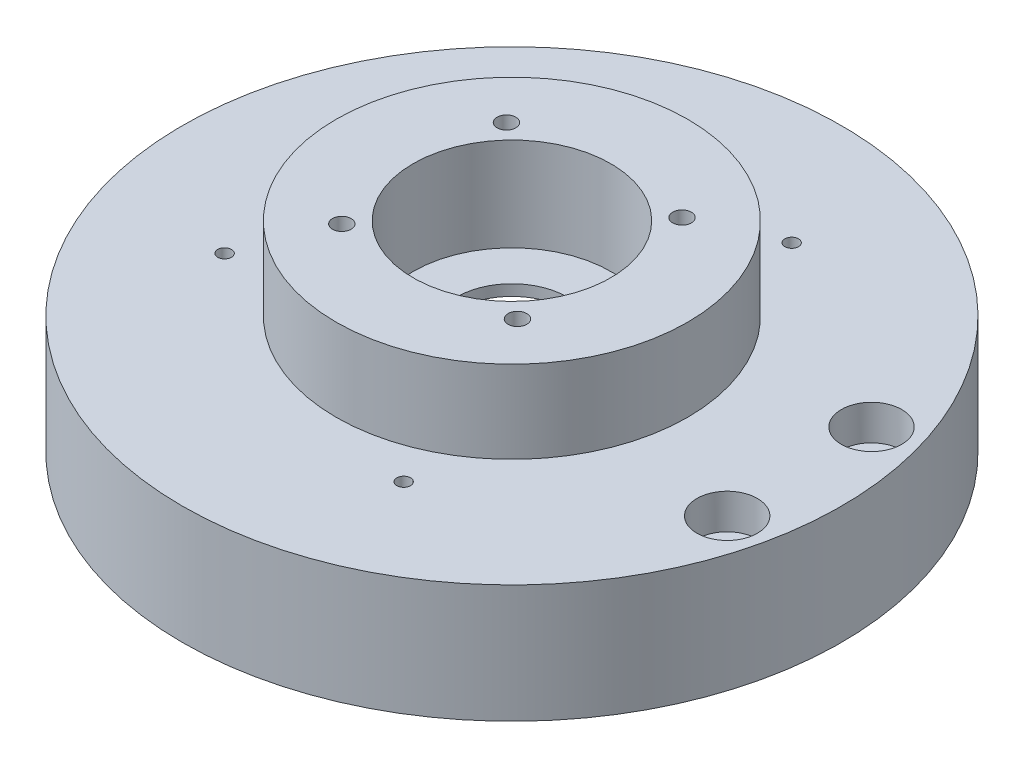
ISO-10303-21;
HEADER;
FILE_DESCRIPTION(('STEP AP214'),'2;1');
FILE_NAME('part.step','',(''),(''),'','','');
FILE_SCHEMA(('AUTOMOTIVE_DESIGN { 1 0 10303 214 1 1 1 1 }'));
ENDSEC;
DATA;
#1=APPLICATION_CONTEXT('core data for automotive mechanical design processes');
#2=APPLICATION_PROTOCOL_DEFINITION('international standard','automotive_design',2000,#1);
#3=PRODUCT_CONTEXT('',#1,'mechanical');
#4=PRODUCT('Part','Part','',(#3));
#5=PRODUCT_RELATED_PRODUCT_CATEGORY('part','',(#4));
#6=PRODUCT_DEFINITION_FORMATION('','',#4);
#7=PRODUCT_DEFINITION_CONTEXT('part definition',#1,'design');
#8=PRODUCT_DEFINITION('design','',#6,#7);
#9=PRODUCT_DEFINITION_SHAPE('','',#8);
#10=(LENGTH_UNIT() NAMED_UNIT(*) SI_UNIT(.MILLI.,.METRE.));
#11=(NAMED_UNIT(*) PLANE_ANGLE_UNIT() SI_UNIT($,.RADIAN.));
#12=(NAMED_UNIT(*) SI_UNIT($,.STERADIAN.) SOLID_ANGLE_UNIT());
#13=UNCERTAINTY_MEASURE_WITH_UNIT(LENGTH_MEASURE(1.E-05),#10,'distance_accuracy_value','');
#14=(GEOMETRIC_REPRESENTATION_CONTEXT(3) GLOBAL_UNCERTAINTY_ASSIGNED_CONTEXT((#13)) GLOBAL_UNIT_ASSIGNED_CONTEXT((#10,
#11,#12)) REPRESENTATION_CONTEXT('',''));
#15=CARTESIAN_POINT('',(0.,0.,0.));
#16=DIRECTION('',(0.,0.,1.));
#17=DIRECTION('',(1.,0.,0.));
#18=AXIS2_PLACEMENT_3D('',#15,#16,#17);
#19=CARTESIAN_POINT('',(0.,36.5,0.));
#20=DIRECTION('',(0.,1.,0.));
#21=DIRECTION('',(0.,0.,1.));
#22=AXIS2_PLACEMENT_3D('',#19,#20,#21);
#23=PLANE('',#22);
#24=CARTESIAN_POINT('',(0.,36.5,0.));
#25=DIRECTION('',(0.,1.,0.));
#26=DIRECTION('',(-1.,0.,0.));
#27=AXIS2_PLACEMENT_3D('',#24,#25,#26);
#28=CIRCLE('',#27,18.);
#29=CARTESIAN_POINT('',(-18.,36.5,0.));
#30=VERTEX_POINT('',#29);
#31=EDGE_CURVE('E239',#30,#30,#28,.T.);
#32=ORIENTED_EDGE('',*,*,#31,.F.);
#33=EDGE_LOOP('',(#32));
#34=FACE_BOUND('',#33,.T.);
#35=CARTESIAN_POINT('',(-15.9871691546974,36.5,-14.9846085841137));
#36=DIRECTION('',(0.,1.,0.));
#37=DIRECTION('',(0.,0.,1.));
#38=AXIS2_PLACEMENT_3D('',#35,#36,#37);
#39=CIRCLE('',#38,1.69999999999999);
#40=CARTESIAN_POINT('',(-15.9871691546974,36.5,-13.2846085841137));
#41=VERTEX_POINT('',#40);
#42=EDGE_CURVE('E200',#41,#41,#39,.T.);
#43=ORIENTED_EDGE('',*,*,#42,.F.);
#44=EDGE_LOOP('',(#43));
#45=FACE_BOUND('',#44,.T.);
#46=CARTESIAN_POINT('',(-14.9846085841137,36.5,15.9871691546974));
#47=DIRECTION('',(0.,1.,0.));
#48=DIRECTION('',(0.,0.,1.));
#49=AXIS2_PLACEMENT_3D('',#46,#47,#48);
#50=CIRCLE('',#49,1.69999999999999);
#51=CARTESIAN_POINT('',(-14.9846085841137,36.5,17.6871691546974));
#52=VERTEX_POINT('',#51);
#53=EDGE_CURVE('E197',#52,#52,#50,.T.);
#54=ORIENTED_EDGE('',*,*,#53,.F.);
#55=EDGE_LOOP('',(#54));
#56=FACE_BOUND('',#55,.T.);
#57=CARTESIAN_POINT('',(15.9871691546974,36.5,14.9846085841137));
#58=DIRECTION('',(0.,1.,0.));
#59=DIRECTION('',(0.,0.,1.));
#60=AXIS2_PLACEMENT_3D('',#57,#58,#59);
#61=CIRCLE('',#60,1.7);
#62=CARTESIAN_POINT('',(15.9871691546974,36.5,16.6846085841137));
#63=VERTEX_POINT('',#62);
#64=EDGE_CURVE('E194',#63,#63,#61,.T.);
#65=ORIENTED_EDGE('',*,*,#64,.F.);
#66=EDGE_LOOP('',(#65));
#67=FACE_BOUND('',#66,.T.);
#68=CARTESIAN_POINT('',(14.9846085841137,36.5,-15.9871691546974));
#69=DIRECTION('',(0.,1.,0.));
#70=DIRECTION('',(0.,0.,1.));
#71=AXIS2_PLACEMENT_3D('',#68,#69,#70);
#72=CIRCLE('',#71,1.7);
#73=CARTESIAN_POINT('',(14.9846085841137,36.5,-14.2871691546974));
#74=VERTEX_POINT('',#73);
#75=EDGE_CURVE('E191',#74,#74,#72,.T.);
#76=ORIENTED_EDGE('',*,*,#75,.F.);
#77=EDGE_LOOP('',(#76));
#78=FACE_BOUND('',#77,.T.);
#79=CARTESIAN_POINT('',(0.,36.5,0.));
#80=DIRECTION('',(0.,1.,0.));
#81=DIRECTION('',(0.,0.,1.));
#82=AXIS2_PLACEMENT_3D('',#79,#80,#81);
#83=CIRCLE('',#82,32.);
#84=CARTESIAN_POINT('',(0.,36.5,32.));
#85=VERTEX_POINT('',#84);
#86=EDGE_CURVE('E143',#85,#85,#83,.T.);
#87=ORIENTED_EDGE('',*,*,#86,.T.);
#88=EDGE_LOOP('',(#87));
#89=FACE_BOUND('',#88,.T.);
#90=ADVANCED_FACE('F34',(#34,#45,#56,#67,#78,#89),#23,.T.);
#91=CARTESIAN_POINT('',(0.,5.,0.));
#92=DIRECTION('',(0.,-1.,0.));
#93=DIRECTION('',(0.,0.,-1.));
#94=AXIS2_PLACEMENT_3D('',#91,#92,#93);
#95=PLANE('',#94);
#96=CARTESIAN_POINT('',(51.1241736514381,5.,11.9402206201396));
#97=DIRECTION('',(0.,-1.,0.));
#98=DIRECTION('',(0.,0.,-1.));
#99=AXIS2_PLACEMENT_3D('',#96,#97,#98);
#100=CIRCLE('',#99,3.19999999999999);
#101=CARTESIAN_POINT('',(53.0567468658178,5.,14.4907422865957));
#102=VERTEX_POINT('',#101);
#103=CARTESIAN_POINT('',(48.2094211776642,5.,13.2609090832636));
#104=VERTEX_POINT('',#103);
#105=EDGE_CURVE('E215',#102,#104,#100,.T.);
#106=ORIENTED_EDGE('',*,*,#105,.F.);
#107=CARTESIAN_POINT('',(0.,5.,0.));
#108=DIRECTION('',(0.,-1.,0.));
#109=DIRECTION('',(0.,0.,-1.));
#110=AXIS2_PLACEMENT_3D('',#107,#108,#109);
#111=CIRCLE('',#110,55.);
#112=CARTESIAN_POINT('',(52.0085222795211,5.,-17.8917190426341));
#113=VERTEX_POINT('',#112);
#114=EDGE_CURVE('E271',#102,#113,#111,.T.);
#115=ORIENTED_EDGE('',*,*,#114,.T.);
#116=CARTESIAN_POINT('',(50.2449434397022,5.,-15.2215524418874));
#117=DIRECTION('',(0.,-1.,0.));
#118=DIRECTION('',(0.,0.,-1.));
#119=AXIS2_PLACEMENT_3D('',#116,#117,#118);
#120=CIRCLE('',#119,3.19999999999999);
#121=CARTESIAN_POINT('',(47.250880650459,5.,-16.3509717679434));
#122=VERTEX_POINT('',#121);
#123=EDGE_CURVE('E228',#122,#113,#120,.T.);
#124=ORIENTED_EDGE('',*,*,#123,.F.);
#125=CARTESIAN_POINT('',(0.,5.,0.));
#126=DIRECTION('',(0.,-1.,0.));
#127=DIRECTION('',(0.,0.,-1.));
#128=AXIS2_PLACEMENT_3D('',#125,#126,#127);
#129=CIRCLE('',#128,50.);
#130=EDGE_CURVE('E272',#104,#122,#129,.T.);
#131=ORIENTED_EDGE('',*,*,#130,.F.);
#132=EDGE_LOOP('',(#106,#115,#124,#131));
#133=FACE_BOUND('',#132,.T.);
#134=ADVANCED_FACE('F318',(#133),#95,.T.);
#135=CARTESIAN_POINT('',(0.,5.,0.));
#136=DIRECTION('',(0.,-1.,0.));
#137=DIRECTION('',(0.,0.,-1.));
#138=AXIS2_PLACEMENT_3D('',#135,#136,#137);
#139=CYLINDRICAL_SURFACE('',#138,50.);
#140=DIRECTION('',(0.,1.,0.));
#141=VECTOR('',#140,1.);
#142=CARTESIAN_POINT('',(48.2094211776642,7.55,13.2609090832636));
#143=LINE('',#142,#141);
#144=CARTESIAN_POINT('',(48.2094211776642,0.,13.2609090832636));
#145=VERTEX_POINT('',#144);
#146=EDGE_CURVE('E217',#104,#145,#143,.F.);
#147=ORIENTED_EDGE('',*,*,#146,.F.);
#148=ORIENTED_EDGE('',*,*,#130,.T.);
#149=DIRECTION('',(0.,1.,0.));
#150=VECTOR('',#149,1.);
#151=CARTESIAN_POINT('',(47.2508806504589,7.55,-16.3509717679434));
#152=LINE('',#151,#150);
#153=CARTESIAN_POINT('',(47.2508806504589,0.,-16.3509717679434));
#154=VERTEX_POINT('',#153);
#155=EDGE_CURVE('E288',#154,#122,#152,.T.);
#156=ORIENTED_EDGE('',*,*,#155,.F.);
#157=CARTESIAN_POINT('',(0.,0.,0.));
#158=DIRECTION('',(0.,-1.,0.));
#159=DIRECTION('',(0.,0.,-1.));
#160=AXIS2_PLACEMENT_3D('',#157,#158,#159);
#161=CIRCLE('',#160,50.);
#162=EDGE_CURVE('E267',#145,#154,#161,.T.);
#163=ORIENTED_EDGE('',*,*,#162,.F.);
#164=EDGE_LOOP('',(#147,#148,#156,#163));
#165=FACE_BOUND('',#164,.T.);
#166=ADVANCED_FACE('F314',(#165),#139,.T.);
#167=CARTESIAN_POINT('',(0.,5.,0.));
#168=DIRECTION('',(0.,-1.,0.));
#169=DIRECTION('',(0.,0.,-1.));
#170=AXIS2_PLACEMENT_3D('',#167,#168,#169);
#171=CYLINDRICAL_SURFACE('',#170,55.);
#172=ORIENTED_EDGE('',*,*,#114,.F.);
#173=DIRECTION('',(0.,1.,0.));
#174=VECTOR('',#173,1.);
#175=CARTESIAN_POINT('',(53.0567468658178,7.55,14.4907422865957));
#176=LINE('',#175,#174);
#177=CARTESIAN_POINT('',(53.0567468658178,0.,14.4907422865957));
#178=VERTEX_POINT('',#177);
#179=EDGE_CURVE('E11',#102,#178,#176,.F.);
#180=ORIENTED_EDGE('',*,*,#179,.T.);
#181=CARTESIAN_POINT('',(0.,0.,0.));
#182=DIRECTION('',(0.,-1.,0.));
#183=DIRECTION('',(0.,0.,-1.));
#184=AXIS2_PLACEMENT_3D('',#181,#182,#183);
#185=CIRCLE('',#184,55.);
#186=CARTESIAN_POINT('',(52.0085222795211,0.,-17.8917190426341));
#187=VERTEX_POINT('',#186);
#188=EDGE_CURVE('E280',#178,#187,#185,.T.);
#189=ORIENTED_EDGE('',*,*,#188,.T.);
#190=DIRECTION('',(0.,1.,0.));
#191=VECTOR('',#190,1.);
#192=CARTESIAN_POINT('',(52.0085222795211,7.55,-17.8917190426341));
#193=LINE('',#192,#191);
#194=EDGE_CURVE('E232',#187,#113,#193,.T.);
#195=ORIENTED_EDGE('',*,*,#194,.T.);
#196=EDGE_LOOP('',(#172,#180,#189,#195));
#197=FACE_BOUND('',#196,.T.);
#198=ADVANCED_FACE('F322',(#197),#171,.F.);
#199=CARTESIAN_POINT('',(0.,0.,0.));
#200=DIRECTION('',(0.,-1.,0.));
#201=DIRECTION('',(0.,0.,-1.));
#202=AXIS2_PLACEMENT_3D('',#199,#200,#201);
#203=CYLINDRICAL_SURFACE('',#202,10.);
#204=CARTESIAN_POINT('',(0.,17.5,0.));
#205=DIRECTION('',(0.,-1.,0.));
#206=DIRECTION('',(0.,0.,-1.));
#207=AXIS2_PLACEMENT_3D('',#204,#205,#206);
#208=CIRCLE('',#207,10.);
#209=CARTESIAN_POINT('',(0.,17.5,-10.));
#210=VERTEX_POINT('',#209);
#211=EDGE_CURVE('E246',#210,#210,#208,.T.);
#212=ORIENTED_EDGE('',*,*,#211,.T.);
#213=EDGE_LOOP('',(#212));
#214=FACE_BOUND('',#213,.T.);
#215=CARTESIAN_POINT('',(0.,19.5,0.));
#216=DIRECTION('',(0.,1.,0.));
#217=DIRECTION('',(-1.,0.,0.));
#218=AXIS2_PLACEMENT_3D('',#215,#216,#217);
#219=CIRCLE('',#218,10.);
#220=CARTESIAN_POINT('',(-10.,19.5,0.));
#221=VERTEX_POINT('',#220);
#222=EDGE_CURVE('E245',#221,#221,#219,.F.);
#223=ORIENTED_EDGE('',*,*,#222,.F.);
#224=EDGE_LOOP('',(#223));
#225=FACE_BOUND('',#224,.T.);
#226=ADVANCED_FACE('F368',(#214,#225),#203,.F.);
#227=CARTESIAN_POINT('',(0.,36.5,0.));
#228=DIRECTION('',(0.,-1.,0.));
#229=DIRECTION('',(0.,0.,-1.));
#230=AXIS2_PLACEMENT_3D('',#227,#228,#229);
#231=CYLINDRICAL_SURFACE('',#230,60.);
#232=CARTESIAN_POINT('',(0.,21.5,0.));
#233=DIRECTION('',(0.,1.,0.));
#234=DIRECTION('',(0.,0.,1.));
#235=AXIS2_PLACEMENT_3D('',#232,#233,#234);
#236=CIRCLE('',#235,60.);
#237=CARTESIAN_POINT('',(0.,21.5,60.));
#238=VERTEX_POINT('',#237);
#239=EDGE_CURVE('E149',#238,#238,#236,.T.);
#240=ORIENTED_EDGE('',*,*,#239,.F.);
#241=EDGE_LOOP('',(#240));
#242=FACE_BOUND('',#241,.T.);
#243=CARTESIAN_POINT('',(0.,0.,0.));
#244=DIRECTION('',(0.,1.,0.));
#245=DIRECTION('',(0.,0.,1.));
#246=AXIS2_PLACEMENT_3D('',#243,#244,#245);
#247=CIRCLE('',#246,60.);
#248=CARTESIAN_POINT('',(0.,0.,60.));
#249=VERTEX_POINT('',#248);
#250=EDGE_CURVE('E276',#249,#249,#247,.T.);
#251=ORIENTED_EDGE('',*,*,#250,.T.);
#252=EDGE_LOOP('',(#251));
#253=FACE_BOUND('',#252,.T.);
#254=ADVANCED_FACE('F36',(#242,#253),#231,.T.);
#255=CARTESIAN_POINT('',(0.,0.,0.));
#256=DIRECTION('',(0.,1.,0.));
#257=DIRECTION('',(0.,0.,1.));
#258=AXIS2_PLACEMENT_3D('',#255,#256,#257);
#259=PLANE('',#258);
#260=ORIENTED_EDGE('',*,*,#188,.F.);
#261=CARTESIAN_POINT('',(51.1241736514381,0.,11.9402206201396));
#262=DIRECTION('',(0.,1.,0.));
#263=DIRECTION('',(0.,0.,1.));
#264=AXIS2_PLACEMENT_3D('',#261,#262,#263);
#265=CIRCLE('',#264,3.19999999999999);
#266=CARTESIAN_POINT('',(53.9865610286713,0.,10.5095779314657));
#267=VERTEX_POINT('',#266);
#268=EDGE_CURVE('E210',#178,#267,#265,.T.);
#269=ORIENTED_EDGE('',*,*,#268,.T.);
#270=CARTESIAN_POINT('',(53.1938617712564,0.,-13.9790224930237));
#271=VERTEX_POINT('',#270);
#272=EDGE_CURVE('E281',#271,#267,#185,.T.);
#273=ORIENTED_EDGE('',*,*,#272,.F.);
#274=CARTESIAN_POINT('',(50.2449434397022,0.,-15.2215524418874));
#275=DIRECTION('',(0.,1.,0.));
#276=DIRECTION('',(0.,0.,1.));
#277=AXIS2_PLACEMENT_3D('',#274,#275,#276);
#278=CIRCLE('',#277,3.19999999999999);
#279=EDGE_CURVE('E225',#271,#187,#278,.T.);
#280=ORIENTED_EDGE('',*,*,#279,.T.);
#281=EDGE_LOOP('',(#260,#269,#273,#280));
#282=FACE_BOUND('',#281,.T.);
#283=ORIENTED_EDGE('',*,*,#250,.F.);
#284=EDGE_LOOP('',(#283));
#285=FACE_BOUND('',#284,.T.);
#286=ADVANCED_FACE('F325',(#282,#285),#259,.F.);
#287=DIRECTION('',(0.,1.,0.));
#288=VECTOR('',#287,1.);
#289=CARTESIAN_POINT('',(49.0959488784557,7.55,9.46508339762836));
#290=LINE('',#289,#288);
#291=CARTESIAN_POINT('',(49.0959488784557,0.,9.46508339762836));
#292=VERTEX_POINT('',#291);
#293=CARTESIAN_POINT('',(49.0959488784557,5.,9.46508339762839));
#294=VERTEX_POINT('',#293);
#295=EDGE_CURVE('E214',#292,#294,#290,.T.);
#296=ORIENTED_EDGE('',*,*,#295,.F.);
#297=CARTESIAN_POINT('',(48.3810379832325,0.,-12.6204264454501));
#298=VERTEX_POINT('',#297);
#299=EDGE_CURVE('E277',#298,#292,#161,.T.);
#300=ORIENTED_EDGE('',*,*,#299,.F.);
#301=DIRECTION('',(0.,1.,0.));
#302=VECTOR('',#301,1.);
#303=CARTESIAN_POINT('',(48.3810379832325,7.55,-12.62042644545));
#304=LINE('',#303,#302);
#305=CARTESIAN_POINT('',(48.3810379832325,5.,-12.6204264454501));
#306=VERTEX_POINT('',#305);
#307=EDGE_CURVE('E57',#306,#298,#304,.F.);
#308=ORIENTED_EDGE('',*,*,#307,.F.);
#309=EDGE_CURVE('E268',#306,#294,#129,.T.);
#310=ORIENTED_EDGE('',*,*,#309,.T.);
#311=EDGE_LOOP('',(#296,#300,#308,#310));
#312=FACE_BOUND('',#311,.T.);
#313=ADVANCED_FACE('F305',(#312),#139,.T.);
#314=ORIENTED_EDGE('',*,*,#272,.T.);
#315=DIRECTION('',(0.,1.,0.));
#316=VECTOR('',#315,1.);
#317=CARTESIAN_POINT('',(53.9865610286713,7.55,10.5095779314657));
#318=LINE('',#317,#316);
#319=CARTESIAN_POINT('',(53.9865610286713,5.,10.5095779314658));
#320=VERTEX_POINT('',#319);
#321=EDGE_CURVE('E43',#267,#320,#318,.T.);
#322=ORIENTED_EDGE('',*,*,#321,.T.);
#323=CARTESIAN_POINT('',(53.1938617712565,5.,-13.9790224930237));
#324=VERTEX_POINT('',#323);
#325=EDGE_CURVE('E273',#324,#320,#111,.T.);
#326=ORIENTED_EDGE('',*,*,#325,.F.);
#327=DIRECTION('',(0.,1.,0.));
#328=VECTOR('',#327,1.);
#329=CARTESIAN_POINT('',(53.1938617712564,7.55,-13.9790224930237));
#330=LINE('',#329,#328);
#331=EDGE_CURVE('E236',#324,#271,#330,.F.);
#332=ORIENTED_EDGE('',*,*,#331,.T.);
#333=EDGE_LOOP('',(#314,#322,#326,#332));
#334=FACE_BOUND('',#333,.T.);
#335=ADVANCED_FACE('F294',(#334),#171,.F.);
#336=EDGE_CURVE('E212',#294,#320,#100,.T.);
#337=ORIENTED_EDGE('',*,*,#336,.F.);
#338=ORIENTED_EDGE('',*,*,#309,.F.);
#339=EDGE_CURVE('E233',#324,#306,#120,.T.);
#340=ORIENTED_EDGE('',*,*,#339,.F.);
#341=ORIENTED_EDGE('',*,*,#325,.T.);
#342=EDGE_LOOP('',(#337,#338,#340,#341));
#343=FACE_BOUND('',#342,.T.);
#344=ADVANCED_FACE('F299',(#343),#95,.T.);
#345=CARTESIAN_POINT('',(0.,0.,0.));
#346=DIRECTION('',(0.,-1.,0.));
#347=DIRECTION('',(0.,0.,-1.));
#348=AXIS2_PLACEMENT_3D('',#345,#346,#347);
#349=CIRCLE('',#348,42.);
#350=CARTESIAN_POINT('',(0.,0.,-42.));
#351=VERTEX_POINT('',#350);
#352=EDGE_CURVE('E264',#351,#351,#349,.T.);
#353=ORIENTED_EDGE('',*,*,#352,.F.);
#354=EDGE_LOOP('',(#353));
#355=FACE_BOUND('',#354,.T.);
#356=ORIENTED_EDGE('',*,*,#299,.T.);
#357=EDGE_CURVE('E209',#292,#145,#265,.T.);
#358=ORIENTED_EDGE('',*,*,#357,.T.);
#359=ORIENTED_EDGE('',*,*,#162,.T.);
#360=EDGE_CURVE('E229',#154,#298,#278,.T.);
#361=ORIENTED_EDGE('',*,*,#360,.T.);
#362=EDGE_LOOP('',(#356,#358,#359,#361));
#363=FACE_BOUND('',#362,.T.);
#364=ADVANCED_FACE('F308',(#355,#363),#259,.F.);
#365=CARTESIAN_POINT('',(0.,0.,0.));
#366=DIRECTION('',(0.,-1.,0.));
#367=DIRECTION('',(0.,0.,-1.));
#368=AXIS2_PLACEMENT_3D('',#365,#366,#367);
#369=CYLINDRICAL_SURFACE('',#368,42.);
#370=CARTESIAN_POINT('',(0.,9.,0.));
#371=DIRECTION('',(0.,-1.,0.));
#372=DIRECTION('',(0.,0.,-1.));
#373=AXIS2_PLACEMENT_3D('',#370,#371,#372);
#374=CIRCLE('',#373,42.);
#375=CARTESIAN_POINT('',(0.,9.,-42.));
#376=VERTEX_POINT('',#375);
#377=EDGE_CURVE('E261',#376,#376,#374,.T.);
#378=ORIENTED_EDGE('',*,*,#377,.F.);
#379=EDGE_LOOP('',(#378));
#380=FACE_BOUND('',#379,.T.);
#381=ORIENTED_EDGE('',*,*,#352,.T.);
#382=EDGE_LOOP('',(#381));
#383=FACE_BOUND('',#382,.T.);
#384=ADVANCED_FACE('F371',(#380,#383),#369,.F.);
#385=CARTESIAN_POINT('',(42.,9.,0.));
#386=DIRECTION('',(0.,1.,0.));
#387=DIRECTION('',(0.,0.,1.));
#388=AXIS2_PLACEMENT_3D('',#385,#386,#387);
#389=PLANE('',#388);
#390=CARTESIAN_POINT('',(0.,9.,0.));
#391=DIRECTION('',(0.,-1.,0.));
#392=DIRECTION('',(0.,0.,-1.));
#393=AXIS2_PLACEMENT_3D('',#390,#391,#392);
#394=CIRCLE('',#393,32.5);
#395=CARTESIAN_POINT('',(0.,9.,-32.5));
#396=VERTEX_POINT('',#395);
#397=EDGE_CURVE('E258',#396,#396,#394,.T.);
#398=ORIENTED_EDGE('',*,*,#397,.F.);
#399=EDGE_LOOP('',(#398));
#400=FACE_BOUND('',#399,.T.);
#401=ORIENTED_EDGE('',*,*,#377,.T.);
#402=EDGE_LOOP('',(#401));
#403=FACE_BOUND('',#402,.T.);
#404=ADVANCED_FACE('F377',(#400,#403),#389,.F.);
#405=CARTESIAN_POINT('',(0.,0.,0.));
#406=DIRECTION('',(0.,-1.,0.));
#407=DIRECTION('',(0.,0.,-1.));
#408=AXIS2_PLACEMENT_3D('',#405,#406,#407);
#409=CYLINDRICAL_SURFACE('',#408,32.5);
#410=CARTESIAN_POINT('',(0.,16.5,0.));
#411=DIRECTION('',(0.,-1.,0.));
#412=DIRECTION('',(0.,0.,-1.));
#413=AXIS2_PLACEMENT_3D('',#410,#411,#412);
#414=CIRCLE('',#413,32.5);
#415=CARTESIAN_POINT('',(0.,16.5,-32.5));
#416=VERTEX_POINT('',#415);
#417=EDGE_CURVE('E255',#416,#416,#414,.T.);
#418=ORIENTED_EDGE('',*,*,#417,.F.);
#419=EDGE_LOOP('',(#418));
#420=FACE_BOUND('',#419,.T.);
#421=ORIENTED_EDGE('',*,*,#397,.T.);
#422=EDGE_LOOP('',(#421));
#423=FACE_BOUND('',#422,.T.);
#424=ADVANCED_FACE('F388',(#420,#423),#409,.F.);
#425=CARTESIAN_POINT('',(32.5,16.5,0.));
#426=DIRECTION('',(0.,1.,0.));
#427=DIRECTION('',(0.,0.,1.));
#428=AXIS2_PLACEMENT_3D('',#425,#426,#427);
#429=PLANE('',#428);
#430=CARTESIAN_POINT('',(0.,16.5,0.));
#431=DIRECTION('',(0.,-1.,0.));
#432=DIRECTION('',(0.,0.,-1.));
#433=AXIS2_PLACEMENT_3D('',#430,#431,#432);
#434=CIRCLE('',#433,29.);
#435=CARTESIAN_POINT('',(0.,16.5,-29.));
#436=VERTEX_POINT('',#435);
#437=EDGE_CURVE('E252',#436,#436,#434,.T.);
#438=ORIENTED_EDGE('',*,*,#437,.F.);
#439=EDGE_LOOP('',(#438));
#440=FACE_BOUND('',#439,.T.);
#441=ORIENTED_EDGE('',*,*,#417,.T.);
#442=EDGE_LOOP('',(#441));
#443=FACE_BOUND('',#442,.T.);
#444=ADVANCED_FACE('F392',(#440,#443),#429,.F.);
#445=CARTESIAN_POINT('',(0.,0.,0.));
#446=DIRECTION('',(0.,-1.,0.));
#447=DIRECTION('',(0.,0.,-1.));
#448=AXIS2_PLACEMENT_3D('',#445,#446,#447);
#449=CYLINDRICAL_SURFACE('',#448,29.);
#450=CARTESIAN_POINT('',(0.,17.5,0.));
#451=DIRECTION('',(0.,-1.,0.));
#452=DIRECTION('',(0.,0.,-1.));
#453=AXIS2_PLACEMENT_3D('',#450,#451,#452);
#454=CIRCLE('',#453,29.);
#455=CARTESIAN_POINT('',(0.,17.5,-29.));
#456=VERTEX_POINT('',#455);
#457=EDGE_CURVE('E249',#456,#456,#454,.T.);
#458=ORIENTED_EDGE('',*,*,#457,.F.);
#459=EDGE_LOOP('',(#458));
#460=FACE_BOUND('',#459,.T.);
#461=ORIENTED_EDGE('',*,*,#437,.T.);
#462=EDGE_LOOP('',(#461));
#463=FACE_BOUND('',#462,.T.);
#464=ADVANCED_FACE('F396',(#460,#463),#449,.F.);
#465=CARTESIAN_POINT('',(29.,17.5,0.));
#466=DIRECTION('',(0.,1.,0.));
#467=DIRECTION('',(0.,0.,1.));
#468=AXIS2_PLACEMENT_3D('',#465,#466,#467);
#469=PLANE('',#468);
#470=CARTESIAN_POINT('',(-15.9871691546974,17.5,-14.9846085841137));
#471=DIRECTION('',(0.,-1.,0.));
#472=DIRECTION('',(0.,0.,-1.));
#473=AXIS2_PLACEMENT_3D('',#470,#471,#472);
#474=CIRCLE('',#473,3.25);
#475=CARTESIAN_POINT('',(-15.9871691546974,17.5,-18.2346085841137));
#476=VERTEX_POINT('',#475);
#477=EDGE_CURVE('E155',#476,#476,#474,.T.);
#478=ORIENTED_EDGE('',*,*,#477,.F.);
#479=EDGE_LOOP('',(#478));
#480=FACE_BOUND('',#479,.T.);
#481=CARTESIAN_POINT('',(14.9846085841137,17.5,-15.9871691546974));
#482=DIRECTION('',(0.,-1.,0.));
#483=DIRECTION('',(0.,0.,-1.));
#484=AXIS2_PLACEMENT_3D('',#481,#482,#483);
#485=CIRCLE('',#484,3.25);
#486=CARTESIAN_POINT('',(14.9846085841137,17.5,-19.2371691546974));
#487=VERTEX_POINT('',#486);
#488=EDGE_CURVE('E164',#487,#487,#485,.T.);
#489=ORIENTED_EDGE('',*,*,#488,.F.);
#490=EDGE_LOOP('',(#489));
#491=FACE_BOUND('',#490,.T.);
#492=CARTESIAN_POINT('',(15.9871691546974,17.5,14.9846085841137));
#493=DIRECTION('',(0.,-1.,0.));
#494=DIRECTION('',(0.,0.,-1.));
#495=AXIS2_PLACEMENT_3D('',#492,#493,#494);
#496=CIRCLE('',#495,3.25);
#497=CARTESIAN_POINT('',(15.9871691546974,17.5,11.7346085841137));
#498=VERTEX_POINT('',#497);
#499=EDGE_CURVE('E173',#498,#498,#496,.T.);
#500=ORIENTED_EDGE('',*,*,#499,.F.);
#501=EDGE_LOOP('',(#500));
#502=FACE_BOUND('',#501,.T.);
#503=CARTESIAN_POINT('',(-14.9846085841137,17.5,15.9871691546974));
#504=DIRECTION('',(0.,-1.,0.));
#505=DIRECTION('',(0.,0.,-1.));
#506=AXIS2_PLACEMENT_3D('',#503,#504,#505);
#507=CIRCLE('',#506,3.25);
#508=CARTESIAN_POINT('',(-14.9846085841137,17.5,12.7371691546974));
#509=VERTEX_POINT('',#508);
#510=EDGE_CURVE('E182',#509,#509,#507,.T.);
#511=ORIENTED_EDGE('',*,*,#510,.F.);
#512=EDGE_LOOP('',(#511));
#513=FACE_BOUND('',#512,.T.);
#514=ORIENTED_EDGE('',*,*,#211,.F.);
#515=EDGE_LOOP('',(#514));
#516=FACE_BOUND('',#515,.T.);
#517=ORIENTED_EDGE('',*,*,#457,.T.);
#518=EDGE_LOOP('',(#517));
#519=FACE_BOUND('',#518,.T.);
#520=ADVANCED_FACE('F400',(#480,#491,#502,#513,#516,#519),#469,.F.);
#521=CARTESIAN_POINT('',(0.,19.5,0.));
#522=DIRECTION('',(0.,1.,0.));
#523=DIRECTION('',(-1.,0.,0.));
#524=AXIS2_PLACEMENT_3D('',#521,#522,#523);
#525=PLANE('',#524);
#526=CARTESIAN_POINT('',(0.,19.5,0.));
#527=DIRECTION('',(0.,1.,0.));
#528=DIRECTION('',(-1.,0.,0.));
#529=AXIS2_PLACEMENT_3D('',#526,#527,#528);
#530=CIRCLE('',#529,18.);
#531=CARTESIAN_POINT('',(-18.,19.5,0.));
#532=VERTEX_POINT('',#531);
#533=EDGE_CURVE('E242',#532,#532,#530,.T.);
#534=ORIENTED_EDGE('',*,*,#533,.T.);
#535=EDGE_LOOP('',(#534));
#536=FACE_BOUND('',#535,.T.);
#537=ORIENTED_EDGE('',*,*,#222,.T.);
#538=EDGE_LOOP('',(#537));
#539=FACE_BOUND('',#538,.T.);
#540=ADVANCED_FACE('F404',(#536,#539),#525,.T.);
#541=CARTESIAN_POINT('',(0.,36.5,0.));
#542=DIRECTION('',(0.,1.,0.));
#543=DIRECTION('',(-1.,0.,0.));
#544=AXIS2_PLACEMENT_3D('',#541,#542,#543);
#545=CYLINDRICAL_SURFACE('',#544,18.);
#546=ORIENTED_EDGE('',*,*,#31,.T.);
#547=EDGE_LOOP('',(#546));
#548=FACE_BOUND('',#547,.T.);
#549=ORIENTED_EDGE('',*,*,#533,.F.);
#550=EDGE_LOOP('',(#549));
#551=FACE_BOUND('',#550,.T.);
#552=ADVANCED_FACE('F411',(#548,#551),#545,.F.);
#553=CARTESIAN_POINT('',(50.2449434397022,36.5,-15.2215524418874));
#554=DIRECTION('',(0.,1.,0.));
#555=DIRECTION('',(0.,0.,1.));
#556=AXIS2_PLACEMENT_3D('',#553,#554,#555);
#557=CYLINDRICAL_SURFACE('',#556,3.19999999999999);
#558=CARTESIAN_POINT('',(50.2449434397022,15.1,-15.2215524418874));
#559=DIRECTION('',(0.,1.,0.));
#560=DIRECTION('',(0.,0.,1.));
#561=AXIS2_PLACEMENT_3D('',#558,#559,#560);
#562=CIRCLE('',#561,3.19999999999999);
#563=CARTESIAN_POINT('',(50.2449434397022,15.1,-12.0215524418874));
#564=VERTEX_POINT('',#563);
#565=EDGE_CURVE('E222',#564,#564,#562,.T.);
#566=ORIENTED_EDGE('',*,*,#565,.T.);
#567=EDGE_LOOP('',(#566));
#568=FACE_BOUND('',#567,.T.);
#569=ORIENTED_EDGE('',*,*,#339,.T.);
#570=ORIENTED_EDGE('',*,*,#307,.T.);
#571=ORIENTED_EDGE('',*,*,#360,.F.);
#572=ORIENTED_EDGE('',*,*,#155,.T.);
#573=ORIENTED_EDGE('',*,*,#123,.T.);
#574=ORIENTED_EDGE('',*,*,#194,.F.);
#575=ORIENTED_EDGE('',*,*,#279,.F.);
#576=ORIENTED_EDGE('',*,*,#331,.F.);
#577=EDGE_LOOP('',(#569,#570,#571,#572,#573,#574,#575,#576));
#578=FACE_BOUND('',#577,.T.);
#579=ADVANCED_FACE('F301',(#568,#578),#557,.F.);
#580=CARTESIAN_POINT('',(53.4449434397022,15.1,-15.2215524418874));
#581=DIRECTION('',(0.,-1.,0.));
#582=DIRECTION('',(0.,0.,-1.));
#583=AXIS2_PLACEMENT_3D('',#580,#581,#582);
#584=PLANE('',#583);
#585=ORIENTED_EDGE('',*,*,#565,.F.);
#586=EDGE_LOOP('',(#585));
#587=FACE_BOUND('',#586,.T.);
#588=CARTESIAN_POINT('',(50.2449434397022,15.1,-15.2215524418874));
#589=DIRECTION('',(0.,1.,0.));
#590=DIRECTION('',(0.,0.,1.));
#591=AXIS2_PLACEMENT_3D('',#588,#589,#590);
#592=CIRCLE('',#591,5.49999999999999);
#593=CARTESIAN_POINT('',(50.2449434397022,15.1,-9.72155244188743));
#594=VERTEX_POINT('',#593);
#595=EDGE_CURVE('E219',#594,#594,#592,.T.);
#596=ORIENTED_EDGE('',*,*,#595,.T.);
#597=EDGE_LOOP('',(#596));
#598=FACE_BOUND('',#597,.T.);
#599=ADVANCED_FACE('F418',(#587,#598),#584,.F.);
#600=CARTESIAN_POINT('',(50.2449434397022,36.5,-15.2215524418874));
#601=DIRECTION('',(0.,1.,0.));
#602=DIRECTION('',(0.,0.,1.));
#603=AXIS2_PLACEMENT_3D('',#600,#601,#602);
#604=CYLINDRICAL_SURFACE('',#603,5.49999999999999);
#605=CARTESIAN_POINT('',(50.2449434397022,21.5,-15.2215524418874));
#606=DIRECTION('',(0.,-1.,0.));
#607=DIRECTION('',(0.,0.,-1.));
#608=AXIS2_PLACEMENT_3D('',#605,#606,#607);
#609=CIRCLE('',#608,5.49999999999999);
#610=CARTESIAN_POINT('',(50.2449434397022,21.5,-20.7215524418874));
#611=VERTEX_POINT('',#610);
#612=EDGE_CURVE('E152',#611,#611,#609,.F.);
#613=ORIENTED_EDGE('',*,*,#612,.T.);
#614=EDGE_LOOP('',(#613));
#615=FACE_BOUND('',#614,.T.);
#616=ORIENTED_EDGE('',*,*,#595,.F.);
#617=EDGE_LOOP('',(#616));
#618=FACE_BOUND('',#617,.T.);
#619=ADVANCED_FACE('F331',(#615,#618),#604,.F.);
#620=CARTESIAN_POINT('',(51.1241736514381,36.5,11.9402206201396));
#621=DIRECTION('',(0.,1.,0.));
#622=DIRECTION('',(0.,0.,1.));
#623=AXIS2_PLACEMENT_3D('',#620,#621,#622);
#624=CYLINDRICAL_SURFACE('',#623,3.19999999999999);
#625=ORIENTED_EDGE('',*,*,#146,.T.);
#626=ORIENTED_EDGE('',*,*,#357,.F.);
#627=ORIENTED_EDGE('',*,*,#295,.T.);
#628=ORIENTED_EDGE('',*,*,#336,.T.);
#629=ORIENTED_EDGE('',*,*,#321,.F.);
#630=ORIENTED_EDGE('',*,*,#268,.F.);
#631=ORIENTED_EDGE('',*,*,#179,.F.);
#632=ORIENTED_EDGE('',*,*,#105,.T.);
#633=EDGE_LOOP('',(#625,#626,#627,#628,#629,#630,#631,#632));
#634=FACE_BOUND('',#633,.T.);
#635=CARTESIAN_POINT('',(51.1241736514381,15.1,11.9402206201396));
#636=DIRECTION('',(0.,1.,0.));
#637=DIRECTION('',(0.,0.,1.));
#638=AXIS2_PLACEMENT_3D('',#635,#636,#637);
#639=CIRCLE('',#638,3.19999999999999);
#640=CARTESIAN_POINT('',(51.1241736514381,15.1,15.1402206201396));
#641=VERTEX_POINT('',#640);
#642=EDGE_CURVE('E206',#641,#641,#639,.T.);
#643=ORIENTED_EDGE('',*,*,#642,.T.);
#644=EDGE_LOOP('',(#643));
#645=FACE_BOUND('',#644,.T.);
#646=ADVANCED_FACE('F327',(#634,#645),#624,.F.);
#647=CARTESIAN_POINT('',(54.3241736514381,15.1,11.9402206201396));
#648=DIRECTION('',(0.,-1.,0.));
#649=DIRECTION('',(0.,0.,-1.));
#650=AXIS2_PLACEMENT_3D('',#647,#648,#649);
#651=PLANE('',#650);
#652=ORIENTED_EDGE('',*,*,#642,.F.);
#653=EDGE_LOOP('',(#652));
#654=FACE_BOUND('',#653,.T.);
#655=CARTESIAN_POINT('',(51.1241736514381,15.1,11.9402206201396));
#656=DIRECTION('',(0.,1.,0.));
#657=DIRECTION('',(0.,0.,1.));
#658=AXIS2_PLACEMENT_3D('',#655,#656,#657);
#659=CIRCLE('',#658,5.49999999999999);
#660=CARTESIAN_POINT('',(51.1241736514381,15.1,17.4402206201396));
#661=VERTEX_POINT('',#660);
#662=EDGE_CURVE('E203',#661,#661,#659,.T.);
#663=ORIENTED_EDGE('',*,*,#662,.T.);
#664=EDGE_LOOP('',(#663));
#665=FACE_BOUND('',#664,.T.);
#666=ADVANCED_FACE('F330',(#654,#665),#651,.F.);
#667=CARTESIAN_POINT('',(51.1241736514381,36.5,11.9402206201396));
#668=DIRECTION('',(0.,1.,0.));
#669=DIRECTION('',(0.,0.,1.));
#670=AXIS2_PLACEMENT_3D('',#667,#668,#669);
#671=CYLINDRICAL_SURFACE('',#670,5.49999999999999);
#672=CARTESIAN_POINT('',(51.1241736514381,21.5,11.9402206201396));
#673=DIRECTION('',(0.,-1.,0.));
#674=DIRECTION('',(0.,0.,-1.));
#675=AXIS2_PLACEMENT_3D('',#672,#673,#674);
#676=CIRCLE('',#675,5.49999999999999);
#677=CARTESIAN_POINT('',(51.1241736514381,21.5,6.4402206201396));
#678=VERTEX_POINT('',#677);
#679=EDGE_CURVE('E38',#678,#678,#676,.F.);
#680=ORIENTED_EDGE('',*,*,#679,.T.);
#681=EDGE_LOOP('',(#680));
#682=FACE_BOUND('',#681,.T.);
#683=ORIENTED_EDGE('',*,*,#662,.F.);
#684=EDGE_LOOP('',(#683));
#685=FACE_BOUND('',#684,.T.);
#686=ADVANCED_FACE('F337',(#682,#685),#671,.F.);
#687=CARTESIAN_POINT('',(-15.9871691546974,36.5,-14.9846085841137));
#688=DIRECTION('',(0.,1.,0.));
#689=DIRECTION('',(0.,0.,1.));
#690=AXIS2_PLACEMENT_3D('',#687,#688,#689);
#691=CYLINDRICAL_SURFACE('',#690,1.69999999999999);
#692=CARTESIAN_POINT('',(-15.9871691546974,22.9,-14.9846085841137));
#693=DIRECTION('',(0.,-1.,0.));
#694=DIRECTION('',(0.,0.,-1.));
#695=AXIS2_PLACEMENT_3D('',#692,#693,#694);
#696=CIRCLE('',#695,1.7);
#697=CARTESIAN_POINT('',(-15.9871691546974,22.9,-16.6846085841137));
#698=VERTEX_POINT('',#697);
#699=EDGE_CURVE('E161',#698,#698,#696,.T.);
#700=ORIENTED_EDGE('',*,*,#699,.T.);
#701=EDGE_LOOP('',(#700));
#702=FACE_BOUND('',#701,.T.);
#703=ORIENTED_EDGE('',*,*,#42,.T.);
#704=EDGE_LOOP('',(#703));
#705=FACE_BOUND('',#704,.T.);
#706=ADVANCED_FACE('F342',(#702,#705),#691,.F.);
#707=CARTESIAN_POINT('',(-14.9846085841137,36.5,15.9871691546974));
#708=DIRECTION('',(0.,1.,0.));
#709=DIRECTION('',(0.,0.,1.));
#710=AXIS2_PLACEMENT_3D('',#707,#708,#709);
#711=CYLINDRICAL_SURFACE('',#710,1.69999999999999);
#712=CARTESIAN_POINT('',(-14.9846085841137,22.9,15.9871691546974));
#713=DIRECTION('',(0.,-1.,0.));
#714=DIRECTION('',(0.,0.,-1.));
#715=AXIS2_PLACEMENT_3D('',#712,#713,#714);
#716=CIRCLE('',#715,1.7);
#717=CARTESIAN_POINT('',(-14.9846085841137,22.9,14.2871691546974));
#718=VERTEX_POINT('',#717);
#719=EDGE_CURVE('E188',#718,#718,#716,.T.);
#720=ORIENTED_EDGE('',*,*,#719,.T.);
#721=EDGE_LOOP('',(#720));
#722=FACE_BOUND('',#721,.T.);
#723=ORIENTED_EDGE('',*,*,#53,.T.);
#724=EDGE_LOOP('',(#723));
#725=FACE_BOUND('',#724,.T.);
#726=ADVANCED_FACE('F348',(#722,#725),#711,.F.);
#727=CARTESIAN_POINT('',(15.9871691546974,36.5,14.9846085841137));
#728=DIRECTION('',(0.,1.,0.));
#729=DIRECTION('',(0.,0.,1.));
#730=AXIS2_PLACEMENT_3D('',#727,#728,#729);
#731=CYLINDRICAL_SURFACE('',#730,1.69999999999999);
#732=CARTESIAN_POINT('',(15.9871691546974,22.9,14.9846085841137));
#733=DIRECTION('',(0.,-1.,0.));
#734=DIRECTION('',(0.,0.,-1.));
#735=AXIS2_PLACEMENT_3D('',#732,#733,#734);
#736=CIRCLE('',#735,1.7);
#737=CARTESIAN_POINT('',(15.9871691546974,22.9,13.2846085841137));
#738=VERTEX_POINT('',#737);
#739=EDGE_CURVE('E179',#738,#738,#736,.T.);
#740=ORIENTED_EDGE('',*,*,#739,.T.);
#741=EDGE_LOOP('',(#740));
#742=FACE_BOUND('',#741,.T.);
#743=ORIENTED_EDGE('',*,*,#64,.T.);
#744=EDGE_LOOP('',(#743));
#745=FACE_BOUND('',#744,.T.);
#746=ADVANCED_FACE('F482',(#742,#745),#731,.F.);
#747=CARTESIAN_POINT('',(14.9846085841137,36.5,-15.9871691546974));
#748=DIRECTION('',(0.,1.,0.));
#749=DIRECTION('',(0.,0.,1.));
#750=AXIS2_PLACEMENT_3D('',#747,#748,#749);
#751=CYLINDRICAL_SURFACE('',#750,1.69999999999999);
#752=CARTESIAN_POINT('',(14.9846085841137,22.9,-15.9871691546974));
#753=DIRECTION('',(0.,-1.,0.));
#754=DIRECTION('',(0.,0.,-1.));
#755=AXIS2_PLACEMENT_3D('',#752,#753,#754);
#756=CIRCLE('',#755,1.7);
#757=CARTESIAN_POINT('',(14.9846085841137,22.9,-17.6871691546974));
#758=VERTEX_POINT('',#757);
#759=EDGE_CURVE('E170',#758,#758,#756,.T.);
#760=ORIENTED_EDGE('',*,*,#759,.T.);
#761=EDGE_LOOP('',(#760));
#762=FACE_BOUND('',#761,.T.);
#763=ORIENTED_EDGE('',*,*,#75,.T.);
#764=EDGE_LOOP('',(#763));
#765=FACE_BOUND('',#764,.T.);
#766=ADVANCED_FACE('F478',(#762,#765),#751,.F.);
#767=CARTESIAN_POINT('',(-13.2846085841137,22.9,15.9871691546974));
#768=DIRECTION('',(0.,1.,0.));
#769=DIRECTION('',(0.,0.,1.));
#770=AXIS2_PLACEMENT_3D('',#767,#768,#769);
#771=PLANE('',#770);
#772=ORIENTED_EDGE('',*,*,#719,.F.);
#773=EDGE_LOOP('',(#772));
#774=FACE_BOUND('',#773,.T.);
#775=CARTESIAN_POINT('',(-14.9846085841137,22.9,15.9871691546974));
#776=DIRECTION('',(0.,-1.,0.));
#777=DIRECTION('',(0.,0.,-1.));
#778=AXIS2_PLACEMENT_3D('',#775,#776,#777);
#779=CIRCLE('',#778,3.25);
#780=CARTESIAN_POINT('',(-14.9846085841137,22.9,12.7371691546974));
#781=VERTEX_POINT('',#780);
#782=EDGE_CURVE('E185',#781,#781,#779,.T.);
#783=ORIENTED_EDGE('',*,*,#782,.T.);
#784=EDGE_LOOP('',(#783));
#785=FACE_BOUND('',#784,.T.);
#786=ADVANCED_FACE('F474',(#774,#785),#771,.F.);
#787=CARTESIAN_POINT('',(-14.9846085841137,17.5,15.9871691546974));
#788=DIRECTION('',(0.,-1.,0.));
#789=DIRECTION('',(0.,0.,-1.));
#790=AXIS2_PLACEMENT_3D('',#787,#788,#789);
#791=CYLINDRICAL_SURFACE('',#790,3.25);
#792=ORIENTED_EDGE('',*,*,#782,.F.);
#793=EDGE_LOOP('',(#792));
#794=FACE_BOUND('',#793,.T.);
#795=ORIENTED_EDGE('',*,*,#510,.T.);
#796=EDGE_LOOP('',(#795));
#797=FACE_BOUND('',#796,.T.);
#798=ADVANCED_FACE('F470',(#794,#797),#791,.F.);
#799=CARTESIAN_POINT('',(17.6871691546974,22.9,14.9846085841137));
#800=DIRECTION('',(0.,1.,0.));
#801=DIRECTION('',(0.,0.,1.));
#802=AXIS2_PLACEMENT_3D('',#799,#800,#801);
#803=PLANE('',#802);
#804=ORIENTED_EDGE('',*,*,#739,.F.);
#805=EDGE_LOOP('',(#804));
#806=FACE_BOUND('',#805,.T.);
#807=CARTESIAN_POINT('',(15.9871691546974,22.9,14.9846085841137));
#808=DIRECTION('',(0.,-1.,0.));
#809=DIRECTION('',(0.,0.,-1.));
#810=AXIS2_PLACEMENT_3D('',#807,#808,#809);
#811=CIRCLE('',#810,3.25);
#812=CARTESIAN_POINT('',(15.9871691546974,22.9,11.7346085841137));
#813=VERTEX_POINT('',#812);
#814=EDGE_CURVE('E176',#813,#813,#811,.T.);
#815=ORIENTED_EDGE('',*,*,#814,.T.);
#816=EDGE_LOOP('',(#815));
#817=FACE_BOUND('',#816,.T.);
#818=ADVANCED_FACE('F466',(#806,#817),#803,.F.);
#819=CARTESIAN_POINT('',(15.9871691546974,17.5,14.9846085841137));
#820=DIRECTION('',(0.,-1.,0.));
#821=DIRECTION('',(0.,0.,-1.));
#822=AXIS2_PLACEMENT_3D('',#819,#820,#821);
#823=CYLINDRICAL_SURFACE('',#822,3.25);
#824=ORIENTED_EDGE('',*,*,#814,.F.);
#825=EDGE_LOOP('',(#824));
#826=FACE_BOUND('',#825,.T.);
#827=ORIENTED_EDGE('',*,*,#499,.T.);
#828=EDGE_LOOP('',(#827));
#829=FACE_BOUND('',#828,.T.);
#830=ADVANCED_FACE('F462',(#826,#829),#823,.F.);
#831=CARTESIAN_POINT('',(16.6846085841137,22.9,-15.9871691546974));
#832=DIRECTION('',(0.,1.,0.));
#833=DIRECTION('',(0.,0.,1.));
#834=AXIS2_PLACEMENT_3D('',#831,#832,#833);
#835=PLANE('',#834);
#836=ORIENTED_EDGE('',*,*,#759,.F.);
#837=EDGE_LOOP('',(#836));
#838=FACE_BOUND('',#837,.T.);
#839=CARTESIAN_POINT('',(14.9846085841137,22.9,-15.9871691546974));
#840=DIRECTION('',(0.,-1.,0.));
#841=DIRECTION('',(0.,0.,-1.));
#842=AXIS2_PLACEMENT_3D('',#839,#840,#841);
#843=CIRCLE('',#842,3.25);
#844=CARTESIAN_POINT('',(14.9846085841137,22.9,-19.2371691546974));
#845=VERTEX_POINT('',#844);
#846=EDGE_CURVE('E167',#845,#845,#843,.T.);
#847=ORIENTED_EDGE('',*,*,#846,.T.);
#848=EDGE_LOOP('',(#847));
#849=FACE_BOUND('',#848,.T.);
#850=ADVANCED_FACE('F458',(#838,#849),#835,.F.);
#851=CARTESIAN_POINT('',(14.9846085841137,17.5,-15.9871691546974));
#852=DIRECTION('',(0.,-1.,0.));
#853=DIRECTION('',(0.,0.,-1.));
#854=AXIS2_PLACEMENT_3D('',#851,#852,#853);
#855=CYLINDRICAL_SURFACE('',#854,3.25);
#856=ORIENTED_EDGE('',*,*,#846,.F.);
#857=EDGE_LOOP('',(#856));
#858=FACE_BOUND('',#857,.T.);
#859=ORIENTED_EDGE('',*,*,#488,.T.);
#860=EDGE_LOOP('',(#859));
#861=FACE_BOUND('',#860,.T.);
#862=ADVANCED_FACE('F454',(#858,#861),#855,.F.);
#863=CARTESIAN_POINT('',(-14.2871691546974,22.9,-14.9846085841137));
#864=DIRECTION('',(0.,1.,0.));
#865=DIRECTION('',(0.,0.,1.));
#866=AXIS2_PLACEMENT_3D('',#863,#864,#865);
#867=PLANE('',#866);
#868=ORIENTED_EDGE('',*,*,#699,.F.);
#869=EDGE_LOOP('',(#868));
#870=FACE_BOUND('',#869,.T.);
#871=CARTESIAN_POINT('',(-15.9871691546974,22.9,-14.9846085841137));
#872=DIRECTION('',(0.,-1.,0.));
#873=DIRECTION('',(0.,0.,-1.));
#874=AXIS2_PLACEMENT_3D('',#871,#872,#873);
#875=CIRCLE('',#874,3.25);
#876=CARTESIAN_POINT('',(-15.9871691546974,22.9,-18.2346085841137));
#877=VERTEX_POINT('',#876);
#878=EDGE_CURVE('E158',#877,#877,#875,.T.);
#879=ORIENTED_EDGE('',*,*,#878,.T.);
#880=EDGE_LOOP('',(#879));
#881=FACE_BOUND('',#880,.T.);
#882=ADVANCED_FACE('F445',(#870,#881),#867,.F.);
#883=CARTESIAN_POINT('',(-15.9871691546974,17.5,-14.9846085841137));
#884=DIRECTION('',(0.,-1.,0.));
#885=DIRECTION('',(0.,0.,-1.));
#886=AXIS2_PLACEMENT_3D('',#883,#884,#885);
#887=CYLINDRICAL_SURFACE('',#886,3.25);
#888=ORIENTED_EDGE('',*,*,#878,.F.);
#889=EDGE_LOOP('',(#888));
#890=FACE_BOUND('',#889,.T.);
#891=ORIENTED_EDGE('',*,*,#477,.T.);
#892=EDGE_LOOP('',(#891));
#893=FACE_BOUND('',#892,.T.);
#894=ADVANCED_FACE('F435',(#890,#893),#887,.F.);
#895=CARTESIAN_POINT('',(-60.,21.5,0.));
#896=DIRECTION('',(0.,-1.,0.));
#897=DIRECTION('',(0.,0.,-1.));
#898=AXIS2_PLACEMENT_3D('',#895,#896,#897);
#899=PLANE('',#898);
#900=CARTESIAN_POINT('',(13.9362244683828,21.5,-36.9865823315273));
#901=DIRECTION('',(0.,1.,0.));
#902=DIRECTION('',(0.,0.,1.));
#903=AXIS2_PLACEMENT_3D('',#900,#901,#902);
#904=CIRCLE('',#903,1.25);
#905=CARTESIAN_POINT('',(13.9362244683828,21.5,-35.7365823315273));
#906=VERTEX_POINT('',#905);
#907=EDGE_CURVE('E121',#906,#906,#904,.T.);
#908=ORIENTED_EDGE('',*,*,#907,.F.);
#909=EDGE_LOOP('',(#908));
#910=FACE_BOUND('',#909,.T.);
#911=CARTESIAN_POINT('',(-36.9865823315275,21.5,-13.9362244683824));
#912=DIRECTION('',(0.,1.,0.));
#913=DIRECTION('',(0.,0.,1.));
#914=AXIS2_PLACEMENT_3D('',#911,#912,#913);
#915=CIRCLE('',#914,1.25);
#916=CARTESIAN_POINT('',(-36.9865823315275,21.5,-12.6862244683824));
#917=VERTEX_POINT('',#916);
#918=EDGE_CURVE('E120',#917,#917,#915,.T.);
#919=ORIENTED_EDGE('',*,*,#918,.F.);
#920=EDGE_LOOP('',(#919));
#921=FACE_BOUND('',#920,.T.);
#922=CARTESIAN_POINT('',(-36.0078620052689,21.5,16.2990643538061));
#923=DIRECTION('',(0.,1.,0.));
#924=DIRECTION('',(0.,0.,1.));
#925=AXIS2_PLACEMENT_3D('',#922,#923,#924);
#926=CIRCLE('',#925,1.25);
#927=CARTESIAN_POINT('',(-36.0078620052689,21.5,17.5490643538061));
#928=VERTEX_POINT('',#927);
#929=EDGE_CURVE('E131',#928,#928,#926,.T.);
#930=ORIENTED_EDGE('',*,*,#929,.F.);
#931=EDGE_LOOP('',(#930));
#932=FACE_BOUND('',#931,.T.);
#933=CARTESIAN_POINT('',(16.2990643538065,21.5,36.0078620052687));
#934=DIRECTION('',(0.,1.,0.));
#935=DIRECTION('',(0.,0.,1.));
#936=AXIS2_PLACEMENT_3D('',#933,#934,#935);
#937=CIRCLE('',#936,1.25);
#938=CARTESIAN_POINT('',(16.2990643538065,21.5,37.2578620052687));
#939=VERTEX_POINT('',#938);
#940=EDGE_CURVE('E137',#939,#939,#937,.T.);
#941=ORIENTED_EDGE('',*,*,#940,.F.);
#942=EDGE_LOOP('',(#941));
#943=FACE_BOUND('',#942,.T.);
#944=ORIENTED_EDGE('',*,*,#679,.F.);
#945=EDGE_LOOP('',(#944));
#946=FACE_BOUND('',#945,.T.);
#947=CARTESIAN_POINT('',(0.,21.5,0.));
#948=DIRECTION('',(0.,1.,0.));
#949=DIRECTION('',(0.,0.,1.));
#950=AXIS2_PLACEMENT_3D('',#947,#948,#949);
#951=CIRCLE('',#950,32.);
#952=CARTESIAN_POINT('',(0.,21.5,32.));
#953=VERTEX_POINT('',#952);
#954=EDGE_CURVE('E146',#953,#953,#951,.T.);
#955=ORIENTED_EDGE('',*,*,#954,.F.);
#956=EDGE_LOOP('',(#955));
#957=FACE_BOUND('',#956,.T.);
#958=ORIENTED_EDGE('',*,*,#239,.T.);
#959=EDGE_LOOP('',(#958));
#960=FACE_BOUND('',#959,.T.);
#961=ORIENTED_EDGE('',*,*,#612,.F.);
#962=EDGE_LOOP('',(#961));
#963=FACE_BOUND('',#962,.T.);
#964=ADVANCED_FACE('F432',(#910,#921,#932,#943,#946,#957,#960,#963),#899,.F.);
#965=CARTESIAN_POINT('',(0.,36.5,0.));
#966=DIRECTION('',(0.,1.,0.));
#967=DIRECTION('',(0.,0.,1.));
#968=AXIS2_PLACEMENT_3D('',#965,#966,#967);
#969=CYLINDRICAL_SURFACE('',#968,32.);
#970=ORIENTED_EDGE('',*,*,#86,.F.);
#971=EDGE_LOOP('',(#970));
#972=FACE_BOUND('',#971,.T.);
#973=ORIENTED_EDGE('',*,*,#954,.T.);
#974=EDGE_LOOP('',(#973));
#975=FACE_BOUND('',#974,.T.);
#976=ADVANCED_FACE('F434',(#972,#975),#969,.T.);
#977=CARTESIAN_POINT('',(16.2990643538065,14.,36.0078620052687));
#978=DIRECTION('',(0.,1.,0.));
#979=DIRECTION('',(0.,0.,1.));
#980=AXIS2_PLACEMENT_3D('',#977,#978,#979);
#981=CONICAL_SURFACE('',#980,1.25,1.02974425867665);
#982=CARTESIAN_POINT('',(16.2990643538064,13.2489242262155,36.0078620052687));
#983=VERTEX_POINT('',#982);
#984=VERTEX_LOOP('',#983);
#985=FACE_BOUND('',#984,.T.);
#986=CARTESIAN_POINT('',(16.2990643538065,14.,36.0078620052687));
#987=DIRECTION('',(0.,1.,0.));
#988=DIRECTION('',(0.,0.,1.));
#989=AXIS2_PLACEMENT_3D('',#986,#987,#988);
#990=CIRCLE('',#989,1.25);
#991=CARTESIAN_POINT('',(16.2990643538065,14.,37.2578620052687));
#992=VERTEX_POINT('',#991);
#993=EDGE_CURVE('E140',#992,#992,#990,.T.);
#994=ORIENTED_EDGE('',*,*,#993,.T.);
#995=EDGE_LOOP('',(#994));
#996=FACE_BOUND('',#995,.T.);
#997=ADVANCED_FACE('F442',(#985,#996),#981,.F.);
#998=CARTESIAN_POINT('',(16.2990643538065,21.5,36.0078620052687));
#999=DIRECTION('',(0.,1.,0.));
#1000=DIRECTION('',(0.,0.,1.));
#1001=AXIS2_PLACEMENT_3D('',#998,#999,#1000);
#1002=CYLINDRICAL_SURFACE('',#1001,1.25);
#1003=ORIENTED_EDGE('',*,*,#993,.F.);
#1004=EDGE_LOOP('',(#1003));
#1005=FACE_BOUND('',#1004,.T.);
#1006=ORIENTED_EDGE('',*,*,#940,.T.);
#1007=EDGE_LOOP('',(#1006));
#1008=FACE_BOUND('',#1007,.T.);
#1009=ADVANCED_FACE('F614',(#1005,#1008),#1002,.F.);
#1010=CARTESIAN_POINT('',(-36.0078620052689,14.,16.2990643538061));
#1011=DIRECTION('',(0.,1.,0.));
#1012=DIRECTION('',(0.,0.,1.));
#1013=AXIS2_PLACEMENT_3D('',#1010,#1011,#1012);
#1014=CONICAL_SURFACE('',#1013,1.25,1.02974425867665);
#1015=CARTESIAN_POINT('',(-36.0078620052689,13.2489242262155,16.2990643538061));
#1016=VERTEX_POINT('',#1015);
#1017=VERTEX_LOOP('',#1016);
#1018=FACE_BOUND('',#1017,.T.);
#1019=CARTESIAN_POINT('',(-36.0078620052689,14.,16.2990643538061));
#1020=DIRECTION('',(0.,1.,0.));
#1021=DIRECTION('',(0.,0.,1.));
#1022=AXIS2_PLACEMENT_3D('',#1019,#1020,#1021);
#1023=CIRCLE('',#1022,1.25);
#1024=CARTESIAN_POINT('',(-36.0078620052689,14.,17.5490643538061));
#1025=VERTEX_POINT('',#1024);
#1026=EDGE_CURVE('E134',#1025,#1025,#1023,.T.);
#1027=ORIENTED_EDGE('',*,*,#1026,.T.);
#1028=EDGE_LOOP('',(#1027));
#1029=FACE_BOUND('',#1028,.T.);
#1030=ADVANCED_FACE('F623',(#1018,#1029),#1014,.F.);
#1031=CARTESIAN_POINT('',(-36.0078620052689,21.5,16.2990643538061));
#1032=DIRECTION('',(0.,1.,0.));
#1033=DIRECTION('',(0.,0.,1.));
#1034=AXIS2_PLACEMENT_3D('',#1031,#1032,#1033);
#1035=CYLINDRICAL_SURFACE('',#1034,1.25);
#1036=ORIENTED_EDGE('',*,*,#1026,.F.);
#1037=EDGE_LOOP('',(#1036));
#1038=FACE_BOUND('',#1037,.T.);
#1039=ORIENTED_EDGE('',*,*,#929,.T.);
#1040=EDGE_LOOP('',(#1039));
#1041=FACE_BOUND('',#1040,.T.);
#1042=ADVANCED_FACE('F633',(#1038,#1041),#1035,.F.);
#1043=CARTESIAN_POINT('',(-36.9865823315275,14.,-13.9362244683824));
#1044=DIRECTION('',(0.,1.,0.));
#1045=DIRECTION('',(0.,0.,1.));
#1046=AXIS2_PLACEMENT_3D('',#1043,#1044,#1045);
#1047=CONICAL_SURFACE('',#1046,1.25,1.02974425867665);
#1048=CARTESIAN_POINT('',(-36.9865823315275,13.2489242262155,-13.9362244683824));
#1049=VERTEX_POINT('',#1048);
#1050=VERTEX_LOOP('',#1049);
#1051=FACE_BOUND('',#1050,.T.);
#1052=CARTESIAN_POINT('',(-36.9865823315275,14.,-13.9362244683824));
#1053=DIRECTION('',(0.,1.,0.));
#1054=DIRECTION('',(0.,0.,1.));
#1055=AXIS2_PLACEMENT_3D('',#1052,#1053,#1054);
#1056=CIRCLE('',#1055,1.25);
#1057=CARTESIAN_POINT('',(-36.9865823315275,14.,-12.6862244683824));
#1058=VERTEX_POINT('',#1057);
#1059=EDGE_CURVE('E124',#1058,#1058,#1056,.T.);
#1060=ORIENTED_EDGE('',*,*,#1059,.T.);
#1061=EDGE_LOOP('',(#1060));
#1062=FACE_BOUND('',#1061,.T.);
#1063=ADVANCED_FACE('F643',(#1051,#1062),#1047,.F.);
#1064=CARTESIAN_POINT('',(-36.9865823315275,21.5,-13.9362244683824));
#1065=DIRECTION('',(0.,1.,0.));
#1066=DIRECTION('',(0.,0.,1.));
#1067=AXIS2_PLACEMENT_3D('',#1064,#1065,#1066);
#1068=CYLINDRICAL_SURFACE('',#1067,1.25);
#1069=ORIENTED_EDGE('',*,*,#1059,.F.);
#1070=EDGE_LOOP('',(#1069));
#1071=FACE_BOUND('',#1070,.T.);
#1072=ORIENTED_EDGE('',*,*,#918,.T.);
#1073=EDGE_LOOP('',(#1072));
#1074=FACE_BOUND('',#1073,.T.);
#1075=ADVANCED_FACE('F114',(#1071,#1074),#1068,.F.);
#1076=CARTESIAN_POINT('',(13.9362244683828,14.,-36.9865823315273));
#1077=DIRECTION('',(0.,1.,0.));
#1078=DIRECTION('',(0.,0.,1.));
#1079=AXIS2_PLACEMENT_3D('',#1076,#1077,#1078);
#1080=CONICAL_SURFACE('',#1079,1.25,1.02974425867665);
#1081=CARTESIAN_POINT('',(13.9362244683828,13.2489242262155,-36.9865823315273));
#1082=VERTEX_POINT('',#1081);
#1083=VERTEX_LOOP('',#1082);
#1084=FACE_BOUND('',#1083,.T.);
#1085=CARTESIAN_POINT('',(13.9362244683828,14.,-36.9865823315273));
#1086=DIRECTION('',(0.,1.,0.));
#1087=DIRECTION('',(0.,0.,1.));
#1088=AXIS2_PLACEMENT_3D('',#1085,#1086,#1087);
#1089=CIRCLE('',#1088,1.25);
#1090=CARTESIAN_POINT('',(13.9362244683828,14.,-35.7365823315273));
#1091=VERTEX_POINT('',#1090);
#1092=EDGE_CURVE('E118',#1091,#1091,#1089,.T.);
#1093=ORIENTED_EDGE('',*,*,#1092,.T.);
#1094=EDGE_LOOP('',(#1093));
#1095=FACE_BOUND('',#1094,.T.);
#1096=ADVANCED_FACE('F110',(#1084,#1095),#1080,.F.);
#1097=CARTESIAN_POINT('',(13.9362244683828,21.5,-36.9865823315273));
#1098=DIRECTION('',(0.,1.,0.));
#1099=DIRECTION('',(0.,0.,1.));
#1100=AXIS2_PLACEMENT_3D('',#1097,#1098,#1099);
#1101=CYLINDRICAL_SURFACE('',#1100,1.25);
#1102=ORIENTED_EDGE('',*,*,#1092,.F.);
#1103=EDGE_LOOP('',(#1102));
#1104=FACE_BOUND('',#1103,.T.);
#1105=ORIENTED_EDGE('',*,*,#907,.T.);
#1106=EDGE_LOOP('',(#1105));
#1107=FACE_BOUND('',#1106,.T.);
#1108=ADVANCED_FACE('F113',(#1104,#1107),#1101,.F.);
#1109=CLOSED_SHELL('',(#90,#134,#166,#198,#226,#254,#286,#313,#335,#344,#364,#384,#404,#424,
#444,#464,#520,#540,#552,#579,#599,#619,#646,#666,#686,#706,#726,#746,#766,#786,#798,#818,#830,
#850,#862,#882,#894,#964,#976,#997,#1009,#1030,#1042,#1063,#1075,#1096,#1108));
#1110=MANIFOLD_SOLID_BREP('B2',#1109);
#1111=ADVANCED_BREP_SHAPE_REPRESENTATION('',(#18,#1110),#14);
#1112=SHAPE_DEFINITION_REPRESENTATION(#9,#1111);
ENDSEC;
END-ISO-10303-21;
